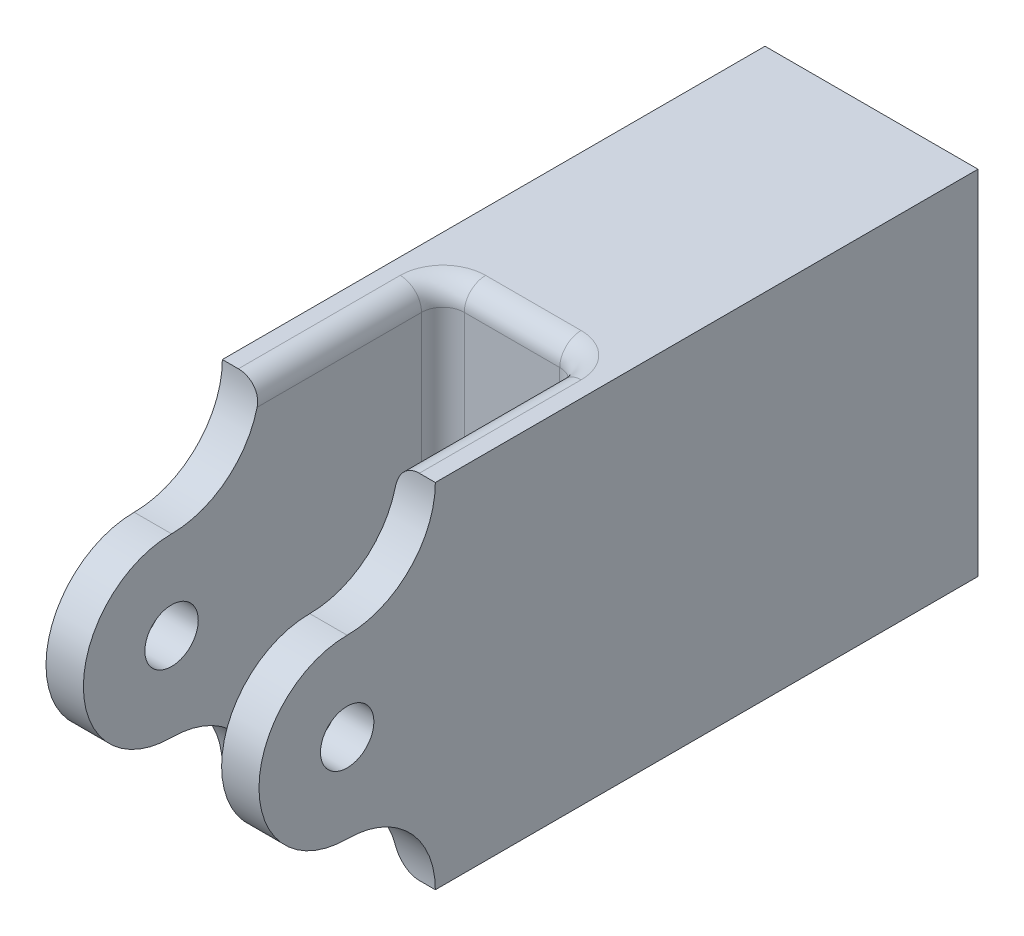
ISO-10303-21;
HEADER;
FILE_DESCRIPTION(('STEP AP214'),'2;1');
FILE_NAME('part.step','',(''),(''),'','','');
FILE_SCHEMA(('AUTOMOTIVE_DESIGN { 1 0 10303 214 1 1 1 1 }'));
ENDSEC;
DATA;
#1=APPLICATION_CONTEXT('core data for automotive mechanical design processes');
#2=APPLICATION_PROTOCOL_DEFINITION('international standard','automotive_design',2000,#1);
#3=PRODUCT_CONTEXT('',#1,'mechanical');
#4=PRODUCT('Part','Part','',(#3));
#5=PRODUCT_RELATED_PRODUCT_CATEGORY('part','',(#4));
#6=PRODUCT_DEFINITION_FORMATION('','',#4);
#7=PRODUCT_DEFINITION_CONTEXT('part definition',#1,'design');
#8=PRODUCT_DEFINITION('design','',#6,#7);
#9=PRODUCT_DEFINITION_SHAPE('','',#8);
#10=(LENGTH_UNIT() NAMED_UNIT(*) SI_UNIT(.MILLI.,.METRE.));
#11=(NAMED_UNIT(*) PLANE_ANGLE_UNIT() SI_UNIT($,.RADIAN.));
#12=(NAMED_UNIT(*) SI_UNIT($,.STERADIAN.) SOLID_ANGLE_UNIT());
#13=UNCERTAINTY_MEASURE_WITH_UNIT(LENGTH_MEASURE(1.E-05),#10,'distance_accuracy_value','');
#14=(GEOMETRIC_REPRESENTATION_CONTEXT(3) GLOBAL_UNCERTAINTY_ASSIGNED_CONTEXT((#13)) GLOBAL_UNIT_ASSIGNED_CONTEXT((#10,
#11,#12)) REPRESENTATION_CONTEXT('',''));
#15=CARTESIAN_POINT('',(0.,0.,0.));
#16=DIRECTION('',(0.,0.,1.));
#17=DIRECTION('',(1.,0.,0.));
#18=AXIS2_PLACEMENT_3D('',#15,#16,#17);
#19=CARTESIAN_POINT('',(19.939,-33.02,0.));
#20=DIRECTION('',(0.,1.,0.));
#21=DIRECTION('',(0.,0.,1.));
#22=AXIS2_PLACEMENT_3D('',#19,#20,#21);
#23=PLANE('',#22);
#24=CARTESIAN_POINT('',(-8.939,-33.02,71.31));
#25=DIRECTION('',(0.,1.,0.));
#26=DIRECTION('',(0.,0.,1.));
#27=AXIS2_PLACEMENT_3D('',#24,#25,#26);
#28=CIRCLE('',#27,8.);
#29=CARTESIAN_POINT('',(-16.939,-33.02,71.31));
#30=VERTEX_POINT('',#29);
#31=CARTESIAN_POINT('',(-8.939,-33.02,63.31));
#32=VERTEX_POINT('',#31);
#33=EDGE_CURVE('E310',#30,#32,#28,.F.);
#34=ORIENTED_EDGE('',*,*,#33,.F.);
#35=DIRECTION('',(0.,0.,-1.));
#36=VECTOR('',#35,1.);
#37=CARTESIAN_POINT('',(-16.939,-33.02,101.6));
#38=LINE('',#37,#36);
#39=CARTESIAN_POINT('',(-16.939,-33.02,101.6));
#40=VERTEX_POINT('',#39);
#41=EDGE_CURVE('E531',#30,#40,#38,.F.);
#42=ORIENTED_EDGE('',*,*,#41,.T.);
#43=DIRECTION('',(-1.,0.,0.));
#44=VECTOR('',#43,1.);
#45=CARTESIAN_POINT('',(19.939,-33.02,101.6));
#46=LINE('',#45,#44);
#47=CARTESIAN_POINT('',(-19.939,-33.02,101.6));
#48=VERTEX_POINT('',#47);
#49=EDGE_CURVE('E396',#40,#48,#46,.T.);
#50=ORIENTED_EDGE('',*,*,#49,.T.);
#51=DIRECTION('',(0.,0.,-1.));
#52=VECTOR('',#51,1.);
#53=CARTESIAN_POINT('',(-19.939,-33.02,0.));
#54=LINE('',#53,#52);
#55=CARTESIAN_POINT('',(-19.939,-33.02,0.));
#56=VERTEX_POINT('',#55);
#57=EDGE_CURVE('E353',#48,#56,#54,.T.);
#58=ORIENTED_EDGE('',*,*,#57,.T.);
#59=DIRECTION('',(-1.,0.,0.));
#60=VECTOR('',#59,1.);
#61=CARTESIAN_POINT('',(19.939,-33.02,0.));
#62=LINE('',#61,#60);
#63=CARTESIAN_POINT('',(19.939,-33.02,0.));
#64=VERTEX_POINT('',#63);
#65=EDGE_CURVE('E239',#64,#56,#62,.T.);
#66=ORIENTED_EDGE('',*,*,#65,.F.);
#67=DIRECTION('',(0.,0.,-1.));
#68=VECTOR('',#67,1.);
#69=CARTESIAN_POINT('',(19.939,-33.02,0.));
#70=LINE('',#69,#68);
#71=CARTESIAN_POINT('',(19.939,-33.02,101.6));
#72=VERTEX_POINT('',#71);
#73=EDGE_CURVE('E375',#72,#64,#70,.T.);
#74=ORIENTED_EDGE('',*,*,#73,.F.);
#75=CARTESIAN_POINT('',(16.939,-33.02,101.6));
#76=VERTEX_POINT('',#75);
#77=EDGE_CURVE('E227',#72,#76,#46,.T.);
#78=ORIENTED_EDGE('',*,*,#77,.T.);
#79=DIRECTION('',(0.,0.,-1.));
#80=VECTOR('',#79,1.);
#81=CARTESIAN_POINT('',(16.939,-33.02,0.));
#82=LINE('',#81,#80);
#83=CARTESIAN_POINT('',(16.939,-33.02,71.31));
#84=VERTEX_POINT('',#83);
#85=EDGE_CURVE('E540',#76,#84,#82,.T.);
#86=ORIENTED_EDGE('',*,*,#85,.T.);
#87=CARTESIAN_POINT('',(8.939,-33.02,71.31));
#88=DIRECTION('',(0.,1.,0.));
#89=DIRECTION('',(0.,0.,1.));
#90=AXIS2_PLACEMENT_3D('',#87,#88,#89);
#91=CIRCLE('',#90,8.);
#92=CARTESIAN_POINT('',(8.939,-33.02,63.31));
#93=VERTEX_POINT('',#92);
#94=EDGE_CURVE('E430',#93,#84,#91,.F.);
#95=ORIENTED_EDGE('',*,*,#94,.F.);
#96=DIRECTION('',(1.,0.,0.));
#97=VECTOR('',#96,1.);
#98=CARTESIAN_POINT('',(-12.939,-33.02,63.31));
#99=LINE('',#98,#97);
#100=EDGE_CURVE('E539',#93,#32,#99,.F.);
#101=ORIENTED_EDGE('',*,*,#100,.T.);
#102=EDGE_LOOP('',(#34,#42,#50,#58,#66,#74,#78,#86,#95,#101));
#103=FACE_BOUND('',#102,.T.);
#104=ADVANCED_FACE('F45',(#103),#23,.F.);
#105=CARTESIAN_POINT('',(19.939,33.02,0.));
#106=DIRECTION('',(0.,-1.,0.));
#107=DIRECTION('',(0.,0.,-1.));
#108=AXIS2_PLACEMENT_3D('',#105,#106,#107);
#109=PLANE('',#108);
#110=DIRECTION('',(-1.,0.,0.));
#111=VECTOR('',#110,1.);
#112=CARTESIAN_POINT('',(19.939,33.02,101.6));
#113=LINE('',#112,#111);
#114=CARTESIAN_POINT('',(-16.939,33.02,101.6));
#115=VERTEX_POINT('',#114);
#116=CARTESIAN_POINT('',(-19.939,33.02,101.6));
#117=VERTEX_POINT('',#116);
#118=EDGE_CURVE('E231',#115,#117,#113,.T.);
#119=ORIENTED_EDGE('',*,*,#118,.F.);
#120=DIRECTION('',(0.,0.,-1.));
#121=VECTOR('',#120,1.);
#122=CARTESIAN_POINT('',(-16.939,33.02,67.31));
#123=LINE('',#122,#121);
#124=CARTESIAN_POINT('',(-16.939,33.02,71.31));
#125=VERTEX_POINT('',#124);
#126=EDGE_CURVE('E263',#115,#125,#123,.T.);
#127=ORIENTED_EDGE('',*,*,#126,.T.);
#128=CARTESIAN_POINT('',(-8.939,33.02,71.31));
#129=DIRECTION('',(0.,-1.,0.));
#130=DIRECTION('',(0.,0.,-1.));
#131=AXIS2_PLACEMENT_3D('',#128,#129,#130);
#132=CIRCLE('',#131,8.);
#133=CARTESIAN_POINT('',(-8.939,33.02,63.31));
#134=VERTEX_POINT('',#133);
#135=EDGE_CURVE('E259',#134,#125,#132,.F.);
#136=ORIENTED_EDGE('',*,*,#135,.F.);
#137=DIRECTION('',(1.,0.,0.));
#138=VECTOR('',#137,1.);
#139=CARTESIAN_POINT('',(12.939,33.02,63.31));
#140=LINE('',#139,#138);
#141=CARTESIAN_POINT('',(8.939,33.02,63.31));
#142=VERTEX_POINT('',#141);
#143=EDGE_CURVE('E253',#134,#142,#140,.T.);
#144=ORIENTED_EDGE('',*,*,#143,.T.);
#145=CARTESIAN_POINT('',(8.939,33.02,71.31));
#146=DIRECTION('',(0.,-1.,0.));
#147=DIRECTION('',(0.,0.,-1.));
#148=AXIS2_PLACEMENT_3D('',#145,#146,#147);
#149=CIRCLE('',#148,8.);
#150=CARTESIAN_POINT('',(16.939,33.02,71.31));
#151=VERTEX_POINT('',#150);
#152=EDGE_CURVE('E243',#151,#142,#149,.F.);
#153=ORIENTED_EDGE('',*,*,#152,.F.);
#154=DIRECTION('',(0.,0.,-1.));
#155=VECTOR('',#154,1.);
#156=CARTESIAN_POINT('',(16.939,33.02,0.));
#157=LINE('',#156,#155);
#158=CARTESIAN_POINT('',(16.939,33.02,101.6));
#159=VERTEX_POINT('',#158);
#160=EDGE_CURVE('E256',#151,#159,#157,.F.);
#161=ORIENTED_EDGE('',*,*,#160,.T.);
#162=CARTESIAN_POINT('',(19.939,33.02,101.6));
#163=VERTEX_POINT('',#162);
#164=EDGE_CURVE('E232',#163,#159,#113,.T.);
#165=ORIENTED_EDGE('',*,*,#164,.F.);
#166=DIRECTION('',(0.,0.,1.));
#167=VECTOR('',#166,1.);
#168=CARTESIAN_POINT('',(19.939,33.02,0.));
#169=LINE('',#168,#167);
#170=CARTESIAN_POINT('',(19.939,33.02,0.));
#171=VERTEX_POINT('',#170);
#172=EDGE_CURVE('E359',#171,#163,#169,.T.);
#173=ORIENTED_EDGE('',*,*,#172,.F.);
#174=DIRECTION('',(-1.,0.,0.));
#175=VECTOR('',#174,1.);
#176=CARTESIAN_POINT('',(19.939,33.02,0.));
#177=LINE('',#176,#175);
#178=CARTESIAN_POINT('',(-19.939,33.02,0.));
#179=VERTEX_POINT('',#178);
#180=EDGE_CURVE('E235',#171,#179,#177,.T.);
#181=ORIENTED_EDGE('',*,*,#180,.T.);
#182=DIRECTION('',(0.,0.,1.));
#183=VECTOR('',#182,1.);
#184=CARTESIAN_POINT('',(-19.939,33.02,0.));
#185=LINE('',#184,#183);
#186=EDGE_CURVE('E352',#179,#117,#185,.T.);
#187=ORIENTED_EDGE('',*,*,#186,.T.);
#188=EDGE_LOOP('',(#119,#127,#136,#144,#153,#161,#165,#173,#181,#187));
#189=FACE_BOUND('',#188,.T.);
#190=ADVANCED_FACE('F298',(#189),#109,.F.);
#191=CARTESIAN_POINT('',(19.939,33.02,118.11));
#192=DIRECTION('',(-1.,0.,0.));
#193=DIRECTION('',(0.,0.,1.));
#194=AXIS2_PLACEMENT_3D('',#191,#192,#193);
#195=CYLINDRICAL_SURFACE('',#194,16.51);
#196=CARTESIAN_POINT('',(-12.939,33.02,118.11));
#197=DIRECTION('',(1.,0.,0.));
#198=DIRECTION('',(0.,0.,-1.));
#199=AXIS2_PLACEMENT_3D('',#196,#197,#198);
#200=CIRCLE('',#199,16.51);
#201=CARTESIAN_POINT('',(-12.939,29.02,102.091882133034));
#202=VERTEX_POINT('',#201);
#203=CARTESIAN_POINT('',(-12.939,16.51,118.11));
#204=VERTEX_POINT('',#203);
#205=EDGE_CURVE('E402',#202,#204,#200,.F.);
#206=ORIENTED_EDGE('',*,*,#205,.F.);
#207=CARTESIAN_POINT('',(-12.939,29.02,102.091882133034));
#208=CARTESIAN_POINT('',(-12.9389873014313,29.1288463720989,102.064690097302));
#209=CARTESIAN_POINT('',(-12.9434425606454,29.2379835447275,102.038626197965));
#210=CARTESIAN_POINT('',(-12.9613393173323,29.4560751474155,101.988866191167));
#211=CARTESIAN_POINT('',(-12.9747820409637,29.5650295505059,101.965170407295));
#212=CARTESIAN_POINT('',(-13.0106983627117,29.781926615139,101.920272780892));
#213=CARTESIAN_POINT('',(-13.0331690849838,29.8898695876755,101.899070146954));
#214=CARTESIAN_POINT('',(-13.0870893187866,30.1039587892796,101.859195322896));
#215=CARTESIAN_POINT('',(-13.1185381932909,30.2101051452565,101.840522953385));
#216=CARTESIAN_POINT('',(-13.1903299209694,30.4199223673825,101.805674724645));
#217=CARTESIAN_POINT('',(-13.2306839326748,30.5235899452596,101.789502041253));
#218=CARTESIAN_POINT('',(-13.3200594583896,30.7275330029294,101.759607909881));
#219=CARTESIAN_POINT('',(-13.3690842013505,30.8278072024087,101.745887378914));
#220=CARTESIAN_POINT('',(-13.475439922587,31.0240449864459,101.720794958354));
#221=CARTESIAN_POINT('',(-13.5327638172189,31.1200121566185,101.709421085677));
#222=CARTESIAN_POINT('',(-13.6553868442897,31.3070045780225,101.688836853192));
#223=CARTESIAN_POINT('',(-13.7206889071351,31.3980279955577,101.679627291995));
#224=CARTESIAN_POINT('',(-13.8577260011991,31.5730196283804,101.663299646181));
#225=CARTESIAN_POINT('',(-13.9293460285112,31.6570751324683,101.65615144087));
#226=CARTESIAN_POINT('',(-14.0793858146552,31.8190716008573,101.643534823842));
#227=CARTESIAN_POINT('',(-14.1578080593692,31.8970103097759,101.638067029579));
#228=CARTESIAN_POINT('',(-14.3208843559027,32.0461649041521,101.628576148607));
#229=CARTESIAN_POINT('',(-14.4055379989878,32.1173812298507,101.624552967244));
#230=CARTESIAN_POINT('',(-14.5804869163236,32.2525934766716,101.617705819658));
#231=CARTESIAN_POINT('',(-14.6707842176794,32.3165867799811,101.614882287202));
#232=CARTESIAN_POINT('',(-14.9503081231113,32.4977133907021,101.607817581235));
#233=CARTESIAN_POINT('',(-15.1473058049193,32.6032063968245,101.605026684865));
#234=CARTESIAN_POINT('',(-15.5559718077176,32.7798949735258,101.601508120652));
#235=CARTESIAN_POINT('',(-15.7676335861898,32.8511057281428,101.600779538684));
#236=CARTESIAN_POINT('',(-16.1398892928321,32.942667590197,101.600135559352));
#237=CARTESIAN_POINT('',(-16.2984125076764,32.9716387237164,101.600050962532));
#238=CARTESIAN_POINT('',(-16.6176059240623,33.0103126313802,101.600000051996));
#239=CARTESIAN_POINT('',(-16.7782734469261,33.0200375257938,101.600033602367));
#240=CARTESIAN_POINT('',(-16.939,33.02,101.6));
#241=B_SPLINE_CURVE_WITH_KNOTS('',3,(#207,#208,#209,#210,#211,#212,#213,#214,#215,#216,#217,
#218,#219,#220,#221,#222,#223,#224,#225,#226,#227,#228,#229,#230,#231,#232,#233,#234,#235,#236,
#237,#238,#239,#240),.UNSPECIFIED.,.F.,.F.,(4,2,2,2,2,2,2,2,2,2,2,2,2,2,2,2,4),(0.,
0.336493072526485,0.673032062127524,1.00946393303534,1.34587193903925,1.68270389722976,
2.01966155565482,2.35633328511969,2.69312904906695,3.02472025122224,3.35643314868185,
3.68812430755312,4.01993529659398,4.68701540862958,5.35379979008975,5.83612783574302,
6.31790120489073),.UNSPECIFIED.);
#242=EDGE_CURVE('E275',#202,#115,#241,.T.);
#243=ORIENTED_EDGE('',*,*,#242,.T.);
#244=ORIENTED_EDGE('',*,*,#118,.T.);
#245=CARTESIAN_POINT('',(-19.939,33.02,118.11));
#246=DIRECTION('',(-1.,0.,0.));
#247=DIRECTION('',(0.,0.,-1.));
#248=AXIS2_PLACEMENT_3D('',#245,#246,#247);
#249=CIRCLE('',#248,16.51);
#250=CARTESIAN_POINT('',(-19.939,16.51,118.11));
#251=VERTEX_POINT('',#250);
#252=EDGE_CURVE('E363',#117,#251,#249,.T.);
#253=ORIENTED_EDGE('',*,*,#252,.T.);
#254=DIRECTION('',(-1.,0.,0.));
#255=VECTOR('',#254,1.);
#256=CARTESIAN_POINT('',(19.939,16.51,118.11));
#257=LINE('',#256,#255);
#258=EDGE_CURVE('E223',#204,#251,#257,.T.);
#259=ORIENTED_EDGE('',*,*,#258,.F.);
#260=EDGE_LOOP('',(#206,#243,#244,#253,#259));
#261=FACE_BOUND('',#260,.T.);
#262=ADVANCED_FACE('F296',(#261),#195,.F.);
#263=CARTESIAN_POINT('',(19.939,0.,118.11));
#264=DIRECTION('',(-1.,0.,0.));
#265=DIRECTION('',(0.,0.,1.));
#266=AXIS2_PLACEMENT_3D('',#263,#264,#265);
#267=CYLINDRICAL_SURFACE('',#266,16.51);
#268=DIRECTION('',(-1.,0.,0.));
#269=VECTOR('',#268,1.);
#270=CARTESIAN_POINT('',(19.939,-16.51,118.11));
#271=LINE('',#270,#269);
#272=CARTESIAN_POINT('',(-12.939,-16.51,118.11));
#273=VERTEX_POINT('',#272);
#274=CARTESIAN_POINT('',(-19.939,-16.51,118.11));
#275=VERTEX_POINT('',#274);
#276=EDGE_CURVE('E224',#273,#275,#271,.T.);
#277=ORIENTED_EDGE('',*,*,#276,.F.);
#278=CARTESIAN_POINT('',(-12.939,0.,118.11));
#279=DIRECTION('',(1.,0.,0.));
#280=DIRECTION('',(0.,0.,-1.));
#281=AXIS2_PLACEMENT_3D('',#278,#279,#280);
#282=CIRCLE('',#281,16.51);
#283=EDGE_CURVE('E405',#204,#273,#282,.T.);
#284=ORIENTED_EDGE('',*,*,#283,.F.);
#285=ORIENTED_EDGE('',*,*,#258,.T.);
#286=CARTESIAN_POINT('',(-19.939,0.,118.11));
#287=DIRECTION('',(1.,0.,0.));
#288=DIRECTION('',(0.,0.,1.));
#289=AXIS2_PLACEMENT_3D('',#286,#287,#288);
#290=CIRCLE('',#289,16.51);
#291=EDGE_CURVE('E368',#251,#275,#290,.T.);
#292=ORIENTED_EDGE('',*,*,#291,.T.);
#293=EDGE_LOOP('',(#277,#284,#285,#292));
#294=FACE_BOUND('',#293,.T.);
#295=ADVANCED_FACE('F525',(#294),#267,.T.);
#296=CARTESIAN_POINT('',(19.939,-33.02,118.11));
#297=DIRECTION('',(-1.,0.,0.));
#298=DIRECTION('',(0.,0.,1.));
#299=AXIS2_PLACEMENT_3D('',#296,#297,#298);
#300=CYLINDRICAL_SURFACE('',#299,16.51);
#301=ORIENTED_EDGE('',*,*,#49,.F.);
#302=CARTESIAN_POINT('',(-16.939,-33.02,101.6));
#303=CARTESIAN_POINT('',(-16.8265588764456,-33.020010747348,101.60000854652));
#304=CARTESIAN_POINT('',(-16.7141228665769,-33.0152589080371,101.600000222878));
#305=CARTESIAN_POINT('',(-16.4900541082301,-32.9963132413383,101.600012013981));
#306=CARTESIAN_POINT('',(-16.3784213234402,-32.9821198435241,101.600032127432));
#307=CARTESIAN_POINT('',(-16.1568140777573,-32.9443865590724,101.600162918165));
#308=CARTESIAN_POINT('',(-16.0468385812458,-32.9208527838141,101.600273536279));
#309=CARTESIAN_POINT('',(-15.8292869493259,-32.8646296807073,101.600707386402));
#310=CARTESIAN_POINT('',(-15.7217107845369,-32.8319404650364,101.601030615805));
#311=CARTESIAN_POINT('',(-15.4036119773151,-32.720401231662,101.602548257056));
#312=CARTESIAN_POINT('',(-15.1976361045679,-32.6280654340261,101.604290455584));
#313=CARTESIAN_POINT('',(-14.8042812434721,-32.4102188737846,101.610907383211));
#314=CARTESIAN_POINT('',(-14.6168991365732,-32.2847136873353,101.615781585981));
#315=CARTESIAN_POINT('',(-14.2663603912207,-32.0044917089101,101.630666609119));
#316=CARTESIAN_POINT('',(-14.1031454176146,-31.8498473763096,101.640664791712));
#317=CARTESIAN_POINT('',(-13.8051306992082,-31.5157884316507,101.667814791029));
#318=CARTESIAN_POINT('',(-13.6703295976078,-31.3363750030269,101.684966266057));
#319=CARTESIAN_POINT('',(-13.4341118750862,-30.9602562455934,101.727906539206));
#320=CARTESIAN_POINT('',(-13.3323743784249,-30.7637421249132,101.753607099386));
#321=CARTESIAN_POINT('',(-13.1629937346541,-30.3579370336882,101.814738729178));
#322=CARTESIAN_POINT('',(-13.0953442553356,-30.1486484442399,101.850167989692));
#323=CARTESIAN_POINT('',(-13.0097921113235,-29.7851610828561,101.9192741486));
#324=CARTESIAN_POINT('',(-12.9831696959046,-29.6324787448255,101.950510511621));
#325=CARTESIAN_POINT('',(-12.9477709763313,-29.326350900049,102.017707747078));
#326=CARTESIAN_POINT('',(-12.9389653190996,-29.1729070667447,102.053660744613));
#327=CARTESIAN_POINT('',(-12.939,-29.02,102.091882133034));
#328=B_SPLINE_CURVE_WITH_KNOTS('',3,(#302,#303,#304,#305,#306,#307,#308,#309,#310,#311,#312,
#313,#314,#315,#316,#317,#318,#319,#320,#321,#322,#323,#324,#325,#326,#327),.UNSPECIFIED.,.F.,
.F.,(4,2,2,2,2,2,2,2,2,2,2,2,4),(0.,0.337213769653127,0.67441219774292,1.01139036073125,
1.34836439505639,2.02206327122536,2.69564896281503,3.36758126211244,4.03948146847846,
4.70465148305656,5.36969788969211,5.84297682890704,6.31547540493402),.UNSPECIFIED.);
#329=CARTESIAN_POINT('',(-12.939,-29.02,102.091882133034));
#330=VERTEX_POINT('',#329);
#331=EDGE_CURVE('E472',#40,#330,#328,.T.);
#332=ORIENTED_EDGE('',*,*,#331,.T.);
#333=CARTESIAN_POINT('',(-12.939,-33.02,118.11));
#334=DIRECTION('',(1.,0.,0.));
#335=DIRECTION('',(0.,0.,-1.));
#336=AXIS2_PLACEMENT_3D('',#333,#334,#335);
#337=CIRCLE('',#336,16.51);
#338=EDGE_CURVE('E249',#273,#330,#337,.F.);
#339=ORIENTED_EDGE('',*,*,#338,.F.);
#340=ORIENTED_EDGE('',*,*,#276,.T.);
#341=CARTESIAN_POINT('',(-19.939,-33.02,118.11));
#342=DIRECTION('',(-1.,0.,0.));
#343=DIRECTION('',(0.,0.,1.));
#344=AXIS2_PLACEMENT_3D('',#341,#342,#343);
#345=CIRCLE('',#344,16.51);
#346=EDGE_CURVE('E373',#275,#48,#345,.T.);
#347=ORIENTED_EDGE('',*,*,#346,.T.);
#348=EDGE_LOOP('',(#301,#332,#339,#340,#347));
#349=FACE_BOUND('',#348,.T.);
#350=ADVANCED_FACE('F482',(#349),#300,.F.);
#351=CARTESIAN_POINT('',(19.939,0.,118.11));
#352=DIRECTION('',(-1.,0.,0.));
#353=DIRECTION('',(0.,0.,1.));
#354=AXIS2_PLACEMENT_3D('',#351,#352,#353);
#355=CYLINDRICAL_SURFACE('',#354,5.);
#356=CARTESIAN_POINT('',(-19.939,0.,118.11));
#357=DIRECTION('',(1.,0.,0.));
#358=DIRECTION('',(0.,0.,-1.));
#359=AXIS2_PLACEMENT_3D('',#356,#357,#358);
#360=CIRCLE('',#359,5.);
#361=CARTESIAN_POINT('',(-19.939,0.,113.11));
#362=VERTEX_POINT('',#361);
#363=EDGE_CURVE('E387',#362,#362,#360,.T.);
#364=ORIENTED_EDGE('',*,*,#363,.F.);
#365=EDGE_LOOP('',(#364));
#366=FACE_BOUND('',#365,.T.);
#367=CARTESIAN_POINT('',(-12.939,0.,118.11));
#368=DIRECTION('',(1.,0.,0.));
#369=DIRECTION('',(0.,0.,-1.));
#370=AXIS2_PLACEMENT_3D('',#367,#368,#369);
#371=CIRCLE('',#370,5.);
#372=CARTESIAN_POINT('',(-12.939,0.,113.11));
#373=VERTEX_POINT('',#372);
#374=EDGE_CURVE('E246',#373,#373,#371,.T.);
#375=ORIENTED_EDGE('',*,*,#374,.T.);
#376=EDGE_LOOP('',(#375));
#377=FACE_BOUND('',#376,.T.);
#378=ADVANCED_FACE('F486',(#366,#377),#355,.F.);
#379=CARTESIAN_POINT('',(19.939,-33.02,118.11));
#380=DIRECTION('',(-1.,0.,0.));
#381=DIRECTION('',(0.,0.,1.));
#382=AXIS2_PLACEMENT_3D('',#379,#380,#381);
#383=PLANE('',#382);
#384=ORIENTED_EDGE('',*,*,#73,.T.);
#385=DIRECTION('',(0.,1.,0.));
#386=VECTOR('',#385,1.);
#387=CARTESIAN_POINT('',(19.939,-33.02,0.));
#388=LINE('',#387,#386);
#389=EDGE_CURVE('E381',#64,#171,#388,.T.);
#390=ORIENTED_EDGE('',*,*,#389,.T.);
#391=ORIENTED_EDGE('',*,*,#172,.T.);
#392=CARTESIAN_POINT('',(19.939,33.02,118.11));
#393=DIRECTION('',(-1.,0.,0.));
#394=DIRECTION('',(0.,0.,-1.));
#395=AXIS2_PLACEMENT_3D('',#392,#393,#394);
#396=CIRCLE('',#395,16.51);
#397=CARTESIAN_POINT('',(19.939,16.51,118.11));
#398=VERTEX_POINT('',#397);
#399=EDGE_CURVE('E392',#163,#398,#396,.T.);
#400=ORIENTED_EDGE('',*,*,#399,.T.);
#401=CARTESIAN_POINT('',(19.939,0.,118.11));
#402=DIRECTION('',(1.,0.,0.));
#403=DIRECTION('',(0.,0.,1.));
#404=AXIS2_PLACEMENT_3D('',#401,#402,#403);
#405=CIRCLE('',#404,16.51);
#406=CARTESIAN_POINT('',(19.939,-16.51,118.11));
#407=VERTEX_POINT('',#406);
#408=EDGE_CURVE('E394',#398,#407,#405,.T.);
#409=ORIENTED_EDGE('',*,*,#408,.T.);
#410=CARTESIAN_POINT('',(19.939,-33.02,118.11));
#411=DIRECTION('',(-1.,0.,0.));
#412=DIRECTION('',(0.,0.,1.));
#413=AXIS2_PLACEMENT_3D('',#410,#411,#412);
#414=CIRCLE('',#413,16.51);
#415=EDGE_CURVE('E222',#407,#72,#414,.T.);
#416=ORIENTED_EDGE('',*,*,#415,.T.);
#417=EDGE_LOOP('',(#384,#390,#391,#400,#409,#416));
#418=FACE_BOUND('',#417,.T.);
#419=CARTESIAN_POINT('',(19.939,0.,118.11));
#420=DIRECTION('',(1.,0.,0.));
#421=DIRECTION('',(0.,0.,-1.));
#422=AXIS2_PLACEMENT_3D('',#419,#420,#421);
#423=CIRCLE('',#422,5.);
#424=CARTESIAN_POINT('',(19.939,0.,113.11));
#425=VERTEX_POINT('',#424);
#426=EDGE_CURVE('E397',#425,#425,#423,.T.);
#427=ORIENTED_EDGE('',*,*,#426,.F.);
#428=EDGE_LOOP('',(#427));
#429=FACE_BOUND('',#428,.T.);
#430=ADVANCED_FACE('F341',(#418,#429),#383,.F.);
#431=CARTESIAN_POINT('',(-19.939,-33.02,118.11));
#432=DIRECTION('',(-1.,0.,0.));
#433=DIRECTION('',(0.,0.,1.));
#434=AXIS2_PLACEMENT_3D('',#431,#432,#433);
#435=PLANE('',#434);
#436=ORIENTED_EDGE('',*,*,#57,.F.);
#437=ORIENTED_EDGE('',*,*,#346,.F.);
#438=ORIENTED_EDGE('',*,*,#291,.F.);
#439=ORIENTED_EDGE('',*,*,#252,.F.);
#440=ORIENTED_EDGE('',*,*,#186,.F.);
#441=DIRECTION('',(0.,1.,0.));
#442=VECTOR('',#441,1.);
#443=CARTESIAN_POINT('',(-19.939,-33.02,0.));
#444=LINE('',#443,#442);
#445=EDGE_CURVE('E345',#56,#179,#444,.T.);
#446=ORIENTED_EDGE('',*,*,#445,.F.);
#447=EDGE_LOOP('',(#436,#437,#438,#439,#440,#446));
#448=FACE_BOUND('',#447,.T.);
#449=ORIENTED_EDGE('',*,*,#363,.T.);
#450=EDGE_LOOP('',(#449));
#451=FACE_BOUND('',#450,.T.);
#452=ADVANCED_FACE('F336',(#448,#451),#435,.T.);
#453=CARTESIAN_POINT('',(19.939,-33.02,0.));
#454=DIRECTION('',(0.,0.,1.));
#455=DIRECTION('',(0.,-1.,0.));
#456=AXIS2_PLACEMENT_3D('',#453,#454,#455);
#457=PLANE('',#456);
#458=ORIENTED_EDGE('',*,*,#445,.T.);
#459=ORIENTED_EDGE('',*,*,#180,.F.);
#460=ORIENTED_EDGE('',*,*,#389,.F.);
#461=ORIENTED_EDGE('',*,*,#65,.T.);
#462=EDGE_LOOP('',(#458,#459,#460,#461));
#463=FACE_BOUND('',#462,.T.);
#464=ADVANCED_FACE('F294',(#463),#457,.F.);
#465=ORIENTED_EDGE('',*,*,#164,.T.);
#466=CARTESIAN_POINT('',(16.939,33.02,101.6));
#467=CARTESIAN_POINT('',(16.8265588764456,33.020010747348,101.60000854652));
#468=CARTESIAN_POINT('',(16.7141228665769,33.0152589080371,101.600000222878));
#469=CARTESIAN_POINT('',(16.4900541082301,32.9963132413383,101.600012013981));
#470=CARTESIAN_POINT('',(16.3784213234402,32.9821198435241,101.600032127432));
#471=CARTESIAN_POINT('',(16.1568140777573,32.9443865590723,101.600162918165));
#472=CARTESIAN_POINT('',(16.0468385812458,32.9208527838141,101.600273536279));
#473=CARTESIAN_POINT('',(15.8292869493259,32.8646296807073,101.600707386402));
#474=CARTESIAN_POINT('',(15.7217107845369,32.8319404650364,101.601030615805));
#475=CARTESIAN_POINT('',(15.4036119773151,32.720401231662,101.602548257056));
#476=CARTESIAN_POINT('',(15.1976361045679,32.6280654340261,101.604290455584));
#477=CARTESIAN_POINT('',(14.8042812434721,32.4102188737846,101.610907383211));
#478=CARTESIAN_POINT('',(14.6168991365732,32.2847136873353,101.615781585981));
#479=CARTESIAN_POINT('',(14.2663603912207,32.0044917089101,101.630666609119));
#480=CARTESIAN_POINT('',(14.1031454176146,31.8498473763096,101.640664791712));
#481=CARTESIAN_POINT('',(13.8051306992082,31.5157884316507,101.667814791029));
#482=CARTESIAN_POINT('',(13.6703295976078,31.3363750030269,101.684966266057));
#483=CARTESIAN_POINT('',(13.4341118750862,30.9602562455934,101.727906539206));
#484=CARTESIAN_POINT('',(13.3323743784249,30.7637421249132,101.753607099386));
#485=CARTESIAN_POINT('',(13.1629937346541,30.3579370336882,101.814738729178));
#486=CARTESIAN_POINT('',(13.0953442553356,30.1486484442399,101.850167989692));
#487=CARTESIAN_POINT('',(13.0097921113235,29.7851610828561,101.9192741486));
#488=CARTESIAN_POINT('',(12.9831696959046,29.6324787448255,101.950510511621));
#489=CARTESIAN_POINT('',(12.9477709763313,29.326350900049,102.017707747078));
#490=CARTESIAN_POINT('',(12.9389653190996,29.1729070667447,102.053660744613));
#491=CARTESIAN_POINT('',(12.939,29.02,102.091882133034));
#492=B_SPLINE_CURVE_WITH_KNOTS('',3,(#466,#467,#468,#469,#470,#471,#472,#473,#474,#475,#476,
#477,#478,#479,#480,#481,#482,#483,#484,#485,#486,#487,#488,#489,#490,#491),.UNSPECIFIED.,.F.,
.F.,(4,2,2,2,2,2,2,2,2,2,2,2,4),(0.,0.337213769653127,0.674412197742923,1.01139036073125,
1.34836439505639,2.02206327122536,2.69564896281503,3.36758126211244,4.03948146847847,
4.70465148305656,5.36969788969211,5.84297682890704,6.31547540493402),.UNSPECIFIED.);
#493=CARTESIAN_POINT('',(12.939,29.02,102.091882133034));
#494=VERTEX_POINT('',#493);
#495=EDGE_CURVE('E302',#159,#494,#492,.T.);
#496=ORIENTED_EDGE('',*,*,#495,.T.);
#497=CARTESIAN_POINT('',(12.939,33.02,118.11));
#498=DIRECTION('',(1.,0.,0.));
#499=DIRECTION('',(0.,0.,-1.));
#500=AXIS2_PLACEMENT_3D('',#497,#498,#499);
#501=CIRCLE('',#500,16.51);
#502=CARTESIAN_POINT('',(12.939,16.51,118.11));
#503=VERTEX_POINT('',#502);
#504=EDGE_CURVE('E208',#494,#503,#501,.F.);
#505=ORIENTED_EDGE('',*,*,#504,.T.);
#506=EDGE_CURVE('E205',#398,#503,#257,.T.);
#507=ORIENTED_EDGE('',*,*,#506,.F.);
#508=ORIENTED_EDGE('',*,*,#399,.F.);
#509=EDGE_LOOP('',(#465,#496,#505,#507,#508));
#510=FACE_BOUND('',#509,.T.);
#511=ADVANCED_FACE('F289',(#510),#195,.F.);
#512=CARTESIAN_POINT('',(12.939,0.,118.11));
#513=DIRECTION('',(1.,0.,0.));
#514=DIRECTION('',(0.,0.,-1.));
#515=AXIS2_PLACEMENT_3D('',#512,#513,#514);
#516=CIRCLE('',#515,16.51);
#517=CARTESIAN_POINT('',(12.939,-16.51,118.11));
#518=VERTEX_POINT('',#517);
#519=EDGE_CURVE('E197',#503,#518,#516,.T.);
#520=ORIENTED_EDGE('',*,*,#519,.T.);
#521=EDGE_CURVE('E202',#407,#518,#271,.T.);
#522=ORIENTED_EDGE('',*,*,#521,.F.);
#523=ORIENTED_EDGE('',*,*,#408,.F.);
#524=ORIENTED_EDGE('',*,*,#506,.T.);
#525=EDGE_LOOP('',(#520,#522,#523,#524));
#526=FACE_BOUND('',#525,.T.);
#527=ADVANCED_FACE('F199',(#526),#267,.T.);
#528=CARTESIAN_POINT('',(12.939,-33.02,118.11));
#529=DIRECTION('',(1.,0.,0.));
#530=DIRECTION('',(0.,0.,-1.));
#531=AXIS2_PLACEMENT_3D('',#528,#529,#530);
#532=CIRCLE('',#531,16.51);
#533=CARTESIAN_POINT('',(12.939,-29.02,102.091882133034));
#534=VERTEX_POINT('',#533);
#535=EDGE_CURVE('E209',#518,#534,#532,.F.);
#536=ORIENTED_EDGE('',*,*,#535,.T.);
#537=CARTESIAN_POINT('',(12.939,-29.02,102.091882133034));
#538=CARTESIAN_POINT('',(12.9389873014313,-29.1288463720989,102.064690097302));
#539=CARTESIAN_POINT('',(12.9434425606454,-29.2379835447276,102.038626197965));
#540=CARTESIAN_POINT('',(12.9613393173323,-29.4560751474155,101.988866191167));
#541=CARTESIAN_POINT('',(12.9747820409637,-29.565029550506,101.965170407295));
#542=CARTESIAN_POINT('',(13.0106983627117,-29.781926615139,101.920272780892));
#543=CARTESIAN_POINT('',(13.0331690849838,-29.8898695876755,101.899070146954));
#544=CARTESIAN_POINT('',(13.0870893187866,-30.1039587892796,101.859195322896));
#545=CARTESIAN_POINT('',(13.1185381932909,-30.2101051452565,101.840522953385));
#546=CARTESIAN_POINT('',(13.1903299209694,-30.4199223673825,101.805674724645));
#547=CARTESIAN_POINT('',(13.2306839326748,-30.5235899452596,101.789502041253));
#548=CARTESIAN_POINT('',(13.3200594583896,-30.7275330029294,101.759607909881));
#549=CARTESIAN_POINT('',(13.3690842013505,-30.8278072024087,101.745887378914));
#550=CARTESIAN_POINT('',(13.475439922587,-31.0240449864459,101.720794958354));
#551=CARTESIAN_POINT('',(13.5327638172189,-31.1200121566186,101.709421085677));
#552=CARTESIAN_POINT('',(13.6553868442897,-31.3070045780225,101.688836853192));
#553=CARTESIAN_POINT('',(13.7206889071351,-31.3980279955577,101.679627291995));
#554=CARTESIAN_POINT('',(13.8577260011991,-31.5730196283804,101.663299646181));
#555=CARTESIAN_POINT('',(13.9293460285112,-31.6570751324684,101.65615144087));
#556=CARTESIAN_POINT('',(14.0793858146552,-31.8190716008573,101.643534823842));
#557=CARTESIAN_POINT('',(14.1578080593692,-31.897010309776,101.638067029579));
#558=CARTESIAN_POINT('',(14.3208843559027,-32.0461649041521,101.628576148607));
#559=CARTESIAN_POINT('',(14.4055379989878,-32.1173812298508,101.624552967244));
#560=CARTESIAN_POINT('',(14.5804869163236,-32.2525934766716,101.617705819658));
#561=CARTESIAN_POINT('',(14.6707842176794,-32.3165867799812,101.614882287202));
#562=CARTESIAN_POINT('',(14.9503081231113,-32.4977133907022,101.607817581235));
#563=CARTESIAN_POINT('',(15.1473058049193,-32.6032063968246,101.605026684865));
#564=CARTESIAN_POINT('',(15.5559718077176,-32.7798949735258,101.601508120652));
#565=CARTESIAN_POINT('',(15.7676335861898,-32.8511057281428,101.600779538684));
#566=CARTESIAN_POINT('',(16.1398892928321,-32.942667590197,101.600135559352));
#567=CARTESIAN_POINT('',(16.2984125076764,-32.9716387237164,101.600050962532));
#568=CARTESIAN_POINT('',(16.6176059240623,-33.0103126313802,101.600000051996));
#569=CARTESIAN_POINT('',(16.7782734469261,-33.0200375257938,101.600033602367));
#570=CARTESIAN_POINT('',(16.939,-33.02,101.6));
#571=B_SPLINE_CURVE_WITH_KNOTS('',3,(#537,#538,#539,#540,#541,#542,#543,#544,#545,#546,#547,
#548,#549,#550,#551,#552,#553,#554,#555,#556,#557,#558,#559,#560,#561,#562,#563,#564,#565,#566,
#567,#568,#569,#570),.UNSPECIFIED.,.F.,.F.,(4,2,2,2,2,2,2,2,2,2,2,2,2,2,2,2,4),(0.,
0.336493072526492,0.673032062127538,1.00946393303536,1.34587193903926,1.68270389722977,
2.01966155565483,2.3563332851197,2.69312904906696,3.02472025122224,3.35643314868186,
3.68812430755313,4.01993529659399,4.68701540862958,5.35379979008975,5.83612783574303,
6.31790120489073),.UNSPECIFIED.);
#572=EDGE_CURVE('E426',#534,#76,#571,.T.);
#573=ORIENTED_EDGE('',*,*,#572,.T.);
#574=ORIENTED_EDGE('',*,*,#77,.F.);
#575=ORIENTED_EDGE('',*,*,#415,.F.);
#576=ORIENTED_EDGE('',*,*,#521,.T.);
#577=EDGE_LOOP('',(#536,#573,#574,#575,#576));
#578=FACE_BOUND('',#577,.T.);
#579=ADVANCED_FACE('F220',(#578),#300,.F.);
#580=CARTESIAN_POINT('',(12.939,0.,118.11));
#581=DIRECTION('',(1.,0.,0.));
#582=DIRECTION('',(0.,0.,-1.));
#583=AXIS2_PLACEMENT_3D('',#580,#581,#582);
#584=CIRCLE('',#583,5.);
#585=CARTESIAN_POINT('',(12.939,0.,113.11));
#586=VERTEX_POINT('',#585);
#587=EDGE_CURVE('E218',#586,#586,#584,.T.);
#588=ORIENTED_EDGE('',*,*,#587,.F.);
#589=EDGE_LOOP('',(#588));
#590=FACE_BOUND('',#589,.T.);
#591=ORIENTED_EDGE('',*,*,#426,.T.);
#592=EDGE_LOOP('',(#591));
#593=FACE_BOUND('',#592,.T.);
#594=ADVANCED_FACE('F481',(#590,#593),#355,.F.);
#595=CARTESIAN_POINT('',(-12.939,-33.02,0.));
#596=DIRECTION('',(1.,0.,0.));
#597=DIRECTION('',(0.,0.,-1.));
#598=AXIS2_PLACEMENT_3D('',#595,#596,#597);
#599=PLANE('',#598);
#600=ORIENTED_EDGE('',*,*,#374,.F.);
#601=EDGE_LOOP('',(#600));
#602=FACE_BOUND('',#601,.T.);
#603=DIRECTION('',(0.,1.,0.));
#604=VECTOR('',#603,1.);
#605=CARTESIAN_POINT('',(-12.939,33.02,71.31));
#606=LINE('',#605,#604);
#607=CARTESIAN_POINT('',(-12.939,-29.02,71.31));
#608=VERTEX_POINT('',#607);
#609=CARTESIAN_POINT('',(-12.939,29.02,71.31));
#610=VERTEX_POINT('',#609);
#611=EDGE_CURVE('E267',#608,#610,#606,.T.);
#612=ORIENTED_EDGE('',*,*,#611,.T.);
#613=DIRECTION('',(0.,0.,-1.));
#614=VECTOR('',#613,1.);
#615=CARTESIAN_POINT('',(-12.939,29.02,101.6));
#616=LINE('',#615,#614);
#617=EDGE_CURVE('E272',#610,#202,#616,.F.);
#618=ORIENTED_EDGE('',*,*,#617,.T.);
#619=ORIENTED_EDGE('',*,*,#205,.T.);
#620=ORIENTED_EDGE('',*,*,#283,.T.);
#621=ORIENTED_EDGE('',*,*,#338,.T.);
#622=DIRECTION('',(0.,0.,-1.));
#623=VECTOR('',#622,1.);
#624=CARTESIAN_POINT('',(-12.939,-29.02,67.31));
#625=LINE('',#624,#623);
#626=EDGE_CURVE('E270',#330,#608,#625,.T.);
#627=ORIENTED_EDGE('',*,*,#626,.T.);
#628=EDGE_LOOP('',(#612,#618,#619,#620,#621,#627));
#629=FACE_BOUND('',#628,.T.);
#630=ADVANCED_FACE('F489',(#602,#629),#599,.T.);
#631=CARTESIAN_POINT('',(12.939,-33.02,0.));
#632=DIRECTION('',(1.,0.,0.));
#633=DIRECTION('',(0.,0.,-1.));
#634=AXIS2_PLACEMENT_3D('',#631,#632,#633);
#635=PLANE('',#634);
#636=ORIENTED_EDGE('',*,*,#504,.F.);
#637=DIRECTION('',(0.,0.,-1.));
#638=VECTOR('',#637,1.);
#639=CARTESIAN_POINT('',(12.939,29.02,0.));
#640=LINE('',#639,#638);
#641=CARTESIAN_POINT('',(12.939,29.02,71.31));
#642=VERTEX_POINT('',#641);
#643=EDGE_CURVE('E311',#494,#642,#640,.T.);
#644=ORIENTED_EDGE('',*,*,#643,.T.);
#645=DIRECTION('',(0.,1.,0.));
#646=VECTOR('',#645,1.);
#647=CARTESIAN_POINT('',(12.939,-33.02,71.31));
#648=LINE('',#647,#646);
#649=CARTESIAN_POINT('',(12.939,-29.02,71.31));
#650=VERTEX_POINT('',#649);
#651=EDGE_CURVE('E283',#642,#650,#648,.F.);
#652=ORIENTED_EDGE('',*,*,#651,.T.);
#653=DIRECTION('',(0.,0.,-1.));
#654=VECTOR('',#653,1.);
#655=CARTESIAN_POINT('',(12.939,-29.02,0.));
#656=LINE('',#655,#654);
#657=EDGE_CURVE('E215',#650,#534,#656,.F.);
#658=ORIENTED_EDGE('',*,*,#657,.T.);
#659=ORIENTED_EDGE('',*,*,#535,.F.);
#660=ORIENTED_EDGE('',*,*,#519,.F.);
#661=EDGE_LOOP('',(#636,#644,#652,#658,#659,#660));
#662=FACE_BOUND('',#661,.T.);
#663=ORIENTED_EDGE('',*,*,#587,.T.);
#664=EDGE_LOOP('',(#663));
#665=FACE_BOUND('',#664,.T.);
#666=ADVANCED_FACE('F212',(#662,#665),#635,.F.);
#667=CARTESIAN_POINT('',(0.,-33.02,67.31));
#668=DIRECTION('',(0.,0.,1.));
#669=DIRECTION('',(1.,0.,0.));
#670=AXIS2_PLACEMENT_3D('',#667,#668,#669);
#671=PLANE('',#670);
#672=DIRECTION('',(1.,0.,0.));
#673=VECTOR('',#672,1.);
#674=CARTESIAN_POINT('',(12.939,-29.02,67.31));
#675=LINE('',#674,#673);
#676=CARTESIAN_POINT('',(-8.939,-29.02,67.31));
#677=VERTEX_POINT('',#676);
#678=CARTESIAN_POINT('',(8.939,-29.02,67.31));
#679=VERTEX_POINT('',#678);
#680=EDGE_CURVE('E70',#677,#679,#675,.T.);
#681=ORIENTED_EDGE('',*,*,#680,.T.);
#682=DIRECTION('',(0.,1.,0.));
#683=VECTOR('',#682,1.);
#684=CARTESIAN_POINT('',(8.939,-33.02,67.31));
#685=LINE('',#684,#683);
#686=CARTESIAN_POINT('',(8.939,29.02,67.31));
#687=VERTEX_POINT('',#686);
#688=EDGE_CURVE('E11',#679,#687,#685,.T.);
#689=ORIENTED_EDGE('',*,*,#688,.T.);
#690=DIRECTION('',(1.,0.,0.));
#691=VECTOR('',#690,1.);
#692=CARTESIAN_POINT('',(-12.939,29.02,67.31));
#693=LINE('',#692,#691);
#694=CARTESIAN_POINT('',(-8.939,29.02,67.31));
#695=VERTEX_POINT('',#694);
#696=EDGE_CURVE('E56',#687,#695,#693,.F.);
#697=ORIENTED_EDGE('',*,*,#696,.T.);
#698=DIRECTION('',(0.,1.,0.));
#699=VECTOR('',#698,1.);
#700=CARTESIAN_POINT('',(-8.939,-33.02,67.31));
#701=LINE('',#700,#699);
#702=EDGE_CURVE('E464',#695,#677,#701,.F.);
#703=ORIENTED_EDGE('',*,*,#702,.T.);
#704=EDGE_LOOP('',(#681,#689,#697,#703));
#705=FACE_BOUND('',#704,.T.);
#706=ADVANCED_FACE('F326',(#705),#671,.T.);
#707=CARTESIAN_POINT('',(16.939,-29.02,0.));
#708=DIRECTION('',(0.,0.,-1.));
#709=DIRECTION('',(0.,1.,0.));
#710=AXIS2_PLACEMENT_3D('',#707,#708,#709);
#711=CYLINDRICAL_SURFACE('',#710,4.);
#712=CARTESIAN_POINT('',(16.939,-29.02,71.31));
#713=DIRECTION('',(0.,0.,-1.));
#714=DIRECTION('',(-1.,0.,0.));
#715=AXIS2_PLACEMENT_3D('',#712,#713,#714);
#716=CIRCLE('',#715,4.);
#717=EDGE_CURVE('E50',#84,#650,#716,.T.);
#718=ORIENTED_EDGE('',*,*,#717,.F.);
#719=ORIENTED_EDGE('',*,*,#85,.F.);
#720=ORIENTED_EDGE('',*,*,#572,.F.);
#721=ORIENTED_EDGE('',*,*,#657,.F.);
#722=EDGE_LOOP('',(#718,#719,#720,#721));
#723=FACE_BOUND('',#722,.T.);
#724=ADVANCED_FACE('F47',(#723),#711,.T.);
#725=CARTESIAN_POINT('',(8.939,-29.02,71.31));
#726=DIRECTION('',(0.,1.,0.));
#727=DIRECTION('',(0.,0.,1.));
#728=AXIS2_PLACEMENT_3D('',#725,#726,#727);
#729=TOROIDAL_SURFACE('',#728,8.,4.);
#730=ORIENTED_EDGE('',*,*,#94,.T.);
#731=ORIENTED_EDGE('',*,*,#717,.T.);
#732=CARTESIAN_POINT('',(8.939,-29.02,71.31));
#733=DIRECTION('',(0.,1.,0.));
#734=DIRECTION('',(0.,0.,1.));
#735=AXIS2_PLACEMENT_3D('',#732,#733,#734);
#736=CIRCLE('',#735,4.);
#737=EDGE_CURVE('E429',#679,#650,#736,.F.);
#738=ORIENTED_EDGE('',*,*,#737,.F.);
#739=CARTESIAN_POINT('',(8.939,-29.02,63.31));
#740=DIRECTION('',(1.,0.,0.));
#741=DIRECTION('',(0.,0.,-1.));
#742=AXIS2_PLACEMENT_3D('',#739,#740,#741);
#743=CIRCLE('',#742,4.);
#744=EDGE_CURVE('E431',#93,#679,#743,.F.);
#745=ORIENTED_EDGE('',*,*,#744,.F.);
#746=EDGE_LOOP('',(#730,#731,#738,#745));
#747=FACE_BOUND('',#746,.T.);
#748=ADVANCED_FACE('F318',(#747),#729,.T.);
#749=CARTESIAN_POINT('',(16.939,29.02,0.));
#750=DIRECTION('',(0.,0.,-1.));
#751=DIRECTION('',(0.,1.,0.));
#752=AXIS2_PLACEMENT_3D('',#749,#750,#751);
#753=CYLINDRICAL_SURFACE('',#752,4.);
#754=ORIENTED_EDGE('',*,*,#495,.F.);
#755=ORIENTED_EDGE('',*,*,#160,.F.);
#756=CARTESIAN_POINT('',(16.939,29.02,71.31));
#757=DIRECTION('',(0.,0.,-1.));
#758=DIRECTION('',(-1.,0.,0.));
#759=AXIS2_PLACEMENT_3D('',#756,#757,#758);
#760=CIRCLE('',#759,4.);
#761=EDGE_CURVE('E416',#642,#151,#760,.T.);
#762=ORIENTED_EDGE('',*,*,#761,.F.);
#763=ORIENTED_EDGE('',*,*,#643,.F.);
#764=EDGE_LOOP('',(#754,#755,#762,#763));
#765=FACE_BOUND('',#764,.T.);
#766=ADVANCED_FACE('F313',(#765),#753,.T.);
#767=CARTESIAN_POINT('',(8.939,-33.02,71.31));
#768=DIRECTION('',(0.,1.,0.));
#769=DIRECTION('',(0.,0.,1.));
#770=AXIS2_PLACEMENT_3D('',#767,#768,#769);
#771=CYLINDRICAL_SURFACE('',#770,4.);
#772=ORIENTED_EDGE('',*,*,#737,.T.);
#773=ORIENTED_EDGE('',*,*,#651,.F.);
#774=CARTESIAN_POINT('',(8.939,29.02,71.31));
#775=DIRECTION('',(0.,-1.,0.));
#776=DIRECTION('',(0.,0.,-1.));
#777=AXIS2_PLACEMENT_3D('',#774,#775,#776);
#778=CIRCLE('',#777,4.);
#779=EDGE_CURVE('E435',#687,#642,#778,.T.);
#780=ORIENTED_EDGE('',*,*,#779,.F.);
#781=ORIENTED_EDGE('',*,*,#688,.F.);
#782=EDGE_LOOP('',(#772,#773,#780,#781));
#783=FACE_BOUND('',#782,.T.);
#784=ADVANCED_FACE('F317',(#783),#771,.F.);
#785=CARTESIAN_POINT('',(0.,-29.02,63.31));
#786=DIRECTION('',(-1.,0.,0.));
#787=DIRECTION('',(0.,0.,1.));
#788=AXIS2_PLACEMENT_3D('',#785,#786,#787);
#789=CYLINDRICAL_SURFACE('',#788,4.);
#790=ORIENTED_EDGE('',*,*,#744,.T.);
#791=ORIENTED_EDGE('',*,*,#680,.F.);
#792=CARTESIAN_POINT('',(-8.939,-29.02,63.31));
#793=DIRECTION('',(-1.,0.,0.));
#794=DIRECTION('',(0.,0.,1.));
#795=AXIS2_PLACEMENT_3D('',#792,#793,#794);
#796=CIRCLE('',#795,4.);
#797=EDGE_CURVE('E438',#32,#677,#796,.T.);
#798=ORIENTED_EDGE('',*,*,#797,.F.);
#799=ORIENTED_EDGE('',*,*,#100,.F.);
#800=EDGE_LOOP('',(#790,#791,#798,#799));
#801=FACE_BOUND('',#800,.T.);
#802=ADVANCED_FACE('F538',(#801),#789,.T.);
#803=CARTESIAN_POINT('',(-16.939,-29.02,0.));
#804=DIRECTION('',(0.,0.,1.));
#805=DIRECTION('',(0.,-1.,0.));
#806=AXIS2_PLACEMENT_3D('',#803,#804,#805);
#807=CYLINDRICAL_SURFACE('',#806,4.);
#808=ORIENTED_EDGE('',*,*,#331,.F.);
#809=ORIENTED_EDGE('',*,*,#41,.F.);
#810=CARTESIAN_POINT('',(-16.939,-29.02,71.31));
#811=DIRECTION('',(0.,0.,-1.));
#812=DIRECTION('',(-1.,0.,0.));
#813=AXIS2_PLACEMENT_3D('',#810,#811,#812);
#814=CIRCLE('',#813,4.);
#815=EDGE_CURVE('E441',#608,#30,#814,.T.);
#816=ORIENTED_EDGE('',*,*,#815,.F.);
#817=ORIENTED_EDGE('',*,*,#626,.F.);
#818=EDGE_LOOP('',(#808,#809,#816,#817));
#819=FACE_BOUND('',#818,.T.);
#820=ADVANCED_FACE('F528',(#819),#807,.T.);
#821=CARTESIAN_POINT('',(8.939,29.02,71.31));
#822=DIRECTION('',(0.,-1.,0.));
#823=DIRECTION('',(0.,0.,-1.));
#824=AXIS2_PLACEMENT_3D('',#821,#822,#823);
#825=TOROIDAL_SURFACE('',#824,8.,4.);
#826=ORIENTED_EDGE('',*,*,#761,.T.);
#827=ORIENTED_EDGE('',*,*,#152,.T.);
#828=CARTESIAN_POINT('',(8.939,29.02,63.31));
#829=DIRECTION('',(1.,0.,0.));
#830=DIRECTION('',(0.,0.,-1.));
#831=AXIS2_PLACEMENT_3D('',#828,#829,#830);
#832=CIRCLE('',#831,4.);
#833=EDGE_CURVE('E444',#687,#142,#832,.F.);
#834=ORIENTED_EDGE('',*,*,#833,.F.);
#835=ORIENTED_EDGE('',*,*,#779,.T.);
#836=EDGE_LOOP('',(#826,#827,#834,#835));
#837=FACE_BOUND('',#836,.T.);
#838=ADVANCED_FACE('F549',(#837),#825,.T.);
#839=CARTESIAN_POINT('',(-8.939,-29.02,71.31));
#840=DIRECTION('',(0.,1.,0.));
#841=DIRECTION('',(0.,0.,1.));
#842=AXIS2_PLACEMENT_3D('',#839,#840,#841);
#843=TOROIDAL_SURFACE('',#842,8.,4.);
#844=ORIENTED_EDGE('',*,*,#33,.T.);
#845=ORIENTED_EDGE('',*,*,#797,.T.);
#846=CARTESIAN_POINT('',(-8.939,-29.02,71.31));
#847=DIRECTION('',(0.,1.,0.));
#848=DIRECTION('',(0.,0.,1.));
#849=AXIS2_PLACEMENT_3D('',#846,#847,#848);
#850=CIRCLE('',#849,4.);
#851=EDGE_CURVE('E448',#608,#677,#850,.F.);
#852=ORIENTED_EDGE('',*,*,#851,.F.);
#853=ORIENTED_EDGE('',*,*,#815,.T.);
#854=EDGE_LOOP('',(#844,#845,#852,#853));
#855=FACE_BOUND('',#854,.T.);
#856=ADVANCED_FACE('F534',(#855),#843,.T.);
#857=CARTESIAN_POINT('',(19.939,29.02,63.31));
#858=DIRECTION('',(-1.,0.,0.));
#859=DIRECTION('',(0.,0.,1.));
#860=AXIS2_PLACEMENT_3D('',#857,#858,#859);
#861=CYLINDRICAL_SURFACE('',#860,4.);
#862=ORIENTED_EDGE('',*,*,#833,.T.);
#863=ORIENTED_EDGE('',*,*,#143,.F.);
#864=CARTESIAN_POINT('',(-8.939,29.02,63.31));
#865=DIRECTION('',(-1.,0.,0.));
#866=DIRECTION('',(0.,0.,1.));
#867=AXIS2_PLACEMENT_3D('',#864,#865,#866);
#868=CIRCLE('',#867,4.);
#869=EDGE_CURVE('E451',#695,#134,#868,.T.);
#870=ORIENTED_EDGE('',*,*,#869,.F.);
#871=ORIENTED_EDGE('',*,*,#696,.F.);
#872=EDGE_LOOP('',(#862,#863,#870,#871));
#873=FACE_BOUND('',#872,.T.);
#874=ADVANCED_FACE('F557',(#873),#861,.T.);
#875=CARTESIAN_POINT('',(-8.939,-33.02,71.31));
#876=DIRECTION('',(0.,-1.,0.));
#877=DIRECTION('',(0.,0.,-1.));
#878=AXIS2_PLACEMENT_3D('',#875,#876,#877);
#879=CYLINDRICAL_SURFACE('',#878,4.);
#880=ORIENTED_EDGE('',*,*,#851,.T.);
#881=ORIENTED_EDGE('',*,*,#702,.F.);
#882=CARTESIAN_POINT('',(-8.939,29.02,71.31));
#883=DIRECTION('',(0.,-1.,0.));
#884=DIRECTION('',(0.,0.,-1.));
#885=AXIS2_PLACEMENT_3D('',#882,#883,#884);
#886=CIRCLE('',#885,4.);
#887=EDGE_CURVE('E455',#610,#695,#886,.T.);
#888=ORIENTED_EDGE('',*,*,#887,.F.);
#889=ORIENTED_EDGE('',*,*,#611,.F.);
#890=EDGE_LOOP('',(#880,#881,#888,#889));
#891=FACE_BOUND('',#890,.T.);
#892=ADVANCED_FACE('F509',(#891),#879,.F.);
#893=CARTESIAN_POINT('',(-8.939,29.02,71.31));
#894=DIRECTION('',(0.,-1.,0.));
#895=DIRECTION('',(0.,0.,-1.));
#896=AXIS2_PLACEMENT_3D('',#893,#894,#895);
#897=TOROIDAL_SURFACE('',#896,8.,4.);
#898=ORIENTED_EDGE('',*,*,#869,.T.);
#899=ORIENTED_EDGE('',*,*,#135,.T.);
#900=CARTESIAN_POINT('',(-16.939,29.02,71.31));
#901=DIRECTION('',(0.,0.,-1.));
#902=DIRECTION('',(-1.,0.,0.));
#903=AXIS2_PLACEMENT_3D('',#900,#901,#902);
#904=CIRCLE('',#903,4.);
#905=EDGE_CURVE('E458',#610,#125,#904,.F.);
#906=ORIENTED_EDGE('',*,*,#905,.F.);
#907=ORIENTED_EDGE('',*,*,#887,.T.);
#908=EDGE_LOOP('',(#898,#899,#906,#907));
#909=FACE_BOUND('',#908,.T.);
#910=ADVANCED_FACE('F516',(#909),#897,.T.);
#911=CARTESIAN_POINT('',(-16.939,29.02,0.));
#912=DIRECTION('',(0.,0.,1.));
#913=DIRECTION('',(0.,-1.,0.));
#914=AXIS2_PLACEMENT_3D('',#911,#912,#913);
#915=CYLINDRICAL_SURFACE('',#914,4.);
#916=ORIENTED_EDGE('',*,*,#242,.F.);
#917=ORIENTED_EDGE('',*,*,#617,.F.);
#918=ORIENTED_EDGE('',*,*,#905,.T.);
#919=ORIENTED_EDGE('',*,*,#126,.F.);
#920=EDGE_LOOP('',(#916,#917,#918,#919));
#921=FACE_BOUND('',#920,.T.);
#922=ADVANCED_FACE('F285',(#921),#915,.T.);
#923=CLOSED_SHELL('',(#104,#190,#262,#295,#350,#378,#430,#452,#464,#511,#527,#579,#594,#630,
#666,#706,#724,#748,#766,#784,#802,#820,#838,#856,#874,#892,#910,#922));
#924=MANIFOLD_SOLID_BREP('B2',#923);
#925=ADVANCED_BREP_SHAPE_REPRESENTATION('',(#18,#924),#14);
#926=SHAPE_DEFINITION_REPRESENTATION(#9,#925);
ENDSEC;
END-ISO-10303-21;
